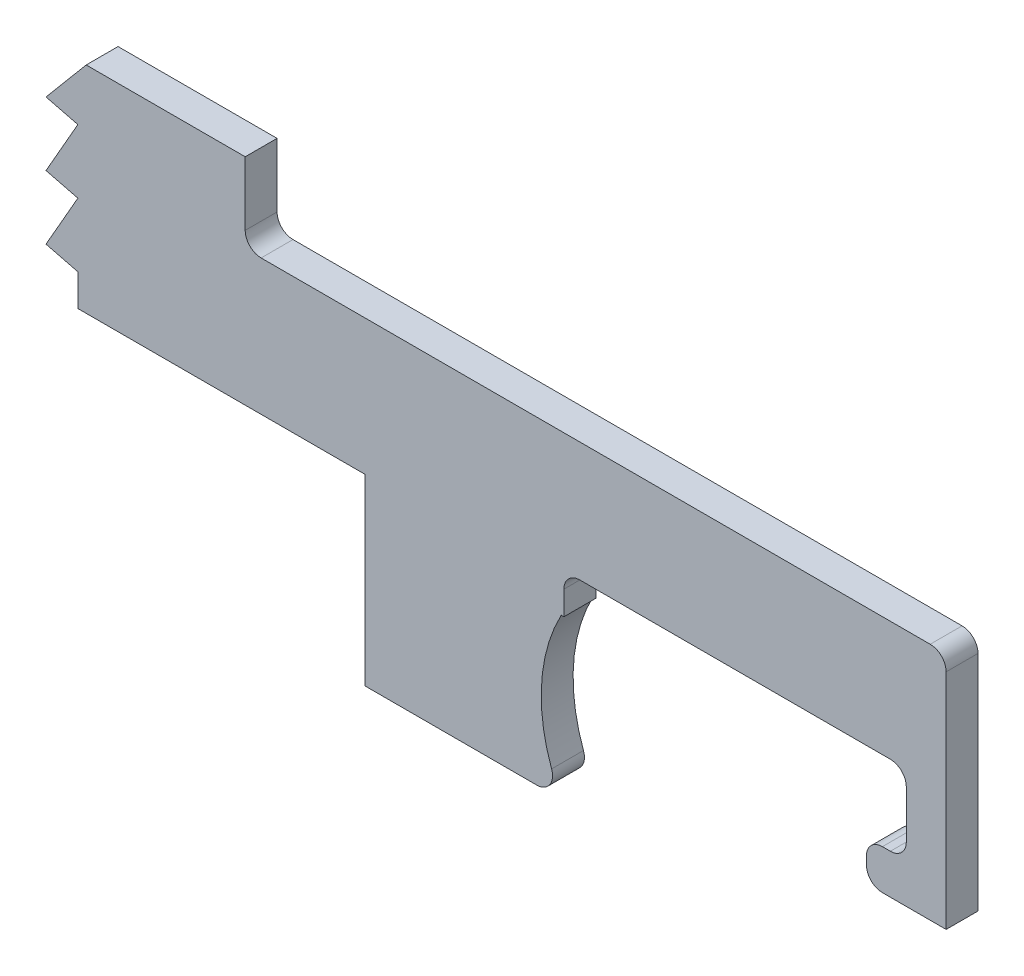
ISO-10303-21;
HEADER;
FILE_DESCRIPTION(('STEP AP214'),'2;1');
FILE_NAME('part.step','',(''),(''),'','','');
FILE_SCHEMA(('AUTOMOTIVE_DESIGN { 1 0 10303 214 1 1 1 1 }'));
ENDSEC;
DATA;
#1=APPLICATION_CONTEXT('core data for automotive mechanical design processes');
#2=APPLICATION_PROTOCOL_DEFINITION('international standard','automotive_design',2000,#1);
#3=PRODUCT_CONTEXT('',#1,'mechanical');
#4=PRODUCT('Part','Part','',(#3));
#5=PRODUCT_RELATED_PRODUCT_CATEGORY('part','',(#4));
#6=PRODUCT_DEFINITION_FORMATION('','',#4);
#7=PRODUCT_DEFINITION_CONTEXT('part definition',#1,'design');
#8=PRODUCT_DEFINITION('design','',#6,#7);
#9=PRODUCT_DEFINITION_SHAPE('','',#8);
#10=(LENGTH_UNIT() NAMED_UNIT(*) SI_UNIT(.MILLI.,.METRE.));
#11=(NAMED_UNIT(*) PLANE_ANGLE_UNIT() SI_UNIT($,.RADIAN.));
#12=(NAMED_UNIT(*) SI_UNIT($,.STERADIAN.) SOLID_ANGLE_UNIT());
#13=UNCERTAINTY_MEASURE_WITH_UNIT(LENGTH_MEASURE(1.E-05),#10,'distance_accuracy_value','');
#14=(GEOMETRIC_REPRESENTATION_CONTEXT(3) GLOBAL_UNCERTAINTY_ASSIGNED_CONTEXT((#13)) GLOBAL_UNIT_ASSIGNED_CONTEXT((#10,
#11,#12)) REPRESENTATION_CONTEXT('',''));
#15=CARTESIAN_POINT('',(0.,0.,0.));
#16=DIRECTION('',(0.,0.,1.));
#17=DIRECTION('',(1.,0.,0.));
#18=AXIS2_PLACEMENT_3D('',#15,#16,#17);
#19=CARTESIAN_POINT('',(-12.17630669051,15.,4.));
#20=DIRECTION('',(0.,-1.,0.));
#21=DIRECTION('',(0.,0.,-1.));
#22=AXIS2_PLACEMENT_3D('',#19,#20,#21);
#23=PLANE('',#22);
#24=DIRECTION('',(-1.,0.,0.));
#25=VECTOR('',#24,1.);
#26=CARTESIAN_POINT('',(-12.17630669051,15.,4.));
#27=LINE('',#26,#25);
#28=CARTESIAN_POINT('',(73.7963422775845,15.,4.));
#29=VERTEX_POINT('',#28);
#30=CARTESIAN_POINT('',(-10.17630669051,15.,4.));
#31=VERTEX_POINT('',#30);
#32=EDGE_CURVE('E283',#29,#31,#27,.T.);
#33=ORIENTED_EDGE('',*,*,#32,.F.);
#34=DIRECTION('',(0.,0.,-1.));
#35=VECTOR('',#34,1.);
#36=CARTESIAN_POINT('',(73.7963422775845,15.,4.));
#37=LINE('',#36,#35);
#38=CARTESIAN_POINT('',(73.7963422775845,15.,0.));
#39=VERTEX_POINT('',#38);
#40=EDGE_CURVE('E436',#29,#39,#37,.T.);
#41=ORIENTED_EDGE('',*,*,#40,.T.);
#42=DIRECTION('',(-1.,0.,0.));
#43=VECTOR('',#42,1.);
#44=CARTESIAN_POINT('',(-12.17630669051,15.,0.));
#45=LINE('',#44,#43);
#46=CARTESIAN_POINT('',(-10.17630669051,15.,0.));
#47=VERTEX_POINT('',#46);
#48=EDGE_CURVE('E282',#39,#47,#45,.T.);
#49=ORIENTED_EDGE('',*,*,#48,.T.);
#50=DIRECTION('',(0.,0.,-1.));
#51=VECTOR('',#50,1.);
#52=CARTESIAN_POINT('',(-10.17630669051,15.,4.));
#53=LINE('',#52,#51);
#54=EDGE_CURVE('E434',#47,#31,#53,.F.);
#55=ORIENTED_EDGE('',*,*,#54,.T.);
#56=EDGE_LOOP('',(#33,#41,#49,#55));
#57=FACE_BOUND('',#56,.T.);
#58=ADVANCED_FACE('F33',(#57),#23,.F.);
#59=CARTESIAN_POINT('',(-12.17630669051,15.,4.));
#60=DIRECTION('',(-1.,0.,0.));
#61=DIRECTION('',(0.,-1.,0.));
#62=AXIS2_PLACEMENT_3D('',#59,#60,#61);
#63=PLANE('',#62);
#64=DIRECTION('',(0.,1.,0.));
#65=VECTOR('',#64,1.);
#66=CARTESIAN_POINT('',(-12.17630669051,15.,4.));
#67=LINE('',#66,#65);
#68=CARTESIAN_POINT('',(-12.17630669051,17.,4.));
#69=VERTEX_POINT('',#68);
#70=CARTESIAN_POINT('',(-12.17630669051,25.,4.));
#71=VERTEX_POINT('',#70);
#72=EDGE_CURVE('E285',#69,#71,#67,.T.);
#73=ORIENTED_EDGE('',*,*,#72,.F.);
#74=DIRECTION('',(0.,0.,-1.));
#75=VECTOR('',#74,1.);
#76=CARTESIAN_POINT('',(-12.17630669051,17.,0.));
#77=LINE('',#76,#75);
#78=CARTESIAN_POINT('',(-12.17630669051,17.,0.));
#79=VERTEX_POINT('',#78);
#80=EDGE_CURVE('E444',#69,#79,#77,.T.);
#81=ORIENTED_EDGE('',*,*,#80,.T.);
#82=DIRECTION('',(0.,1.,0.));
#83=VECTOR('',#82,1.);
#84=CARTESIAN_POINT('',(-12.17630669051,15.,0.));
#85=LINE('',#84,#83);
#86=CARTESIAN_POINT('',(-12.17630669051,25.,0.));
#87=VERTEX_POINT('',#86);
#88=EDGE_CURVE('E323',#79,#87,#85,.T.);
#89=ORIENTED_EDGE('',*,*,#88,.T.);
#90=DIRECTION('',(0.,0.,-1.));
#91=VECTOR('',#90,1.);
#92=CARTESIAN_POINT('',(-12.17630669051,25.,4.));
#93=LINE('',#92,#91);
#94=EDGE_CURVE('E370',#71,#87,#93,.T.);
#95=ORIENTED_EDGE('',*,*,#94,.F.);
#96=EDGE_LOOP('',(#73,#81,#89,#95));
#97=FACE_BOUND('',#96,.T.);
#98=ADVANCED_FACE('F466',(#97),#63,.F.);
#99=CARTESIAN_POINT('',(-12.17630669051,25.,4.));
#100=DIRECTION('',(0.,-1.,0.));
#101=DIRECTION('',(0.,0.,-1.));
#102=AXIS2_PLACEMENT_3D('',#99,#100,#101);
#103=PLANE('',#102);
#104=DIRECTION('',(-1.,0.,0.));
#105=VECTOR('',#104,1.);
#106=CARTESIAN_POINT('',(-12.17630669051,25.,0.));
#107=LINE('',#106,#105);
#108=CARTESIAN_POINT('',(-32.133784183543,25.,0.));
#109=VERTEX_POINT('',#108);
#110=EDGE_CURVE('E325',#87,#109,#107,.T.);
#111=ORIENTED_EDGE('',*,*,#110,.T.);
#112=DIRECTION('',(0.,0.,1.));
#113=VECTOR('',#112,1.);
#114=CARTESIAN_POINT('',(-32.133784183543,25.,-6.));
#115=LINE('',#114,#113);
#116=CARTESIAN_POINT('',(-32.133784183543,25.,4.));
#117=VERTEX_POINT('',#116);
#118=EDGE_CURVE('E269',#109,#117,#115,.T.);
#119=ORIENTED_EDGE('',*,*,#118,.T.);
#120=DIRECTION('',(-1.,0.,0.));
#121=VECTOR('',#120,1.);
#122=CARTESIAN_POINT('',(-12.17630669051,25.,4.));
#123=LINE('',#122,#121);
#124=EDGE_CURVE('E288',#71,#117,#123,.T.);
#125=ORIENTED_EDGE('',*,*,#124,.F.);
#126=ORIENTED_EDGE('',*,*,#94,.T.);
#127=EDGE_LOOP('',(#111,#119,#125,#126));
#128=FACE_BOUND('',#127,.T.);
#129=ADVANCED_FACE('F472',(#128),#103,.F.);
#130=CARTESIAN_POINT('',(-37.17630669051,-1.99999999999999,4.));
#131=DIRECTION('',(0.,1.,0.));
#132=DIRECTION('',(-1.,0.,0.));
#133=AXIS2_PLACEMENT_3D('',#130,#131,#132);
#134=PLANE('',#133);
#135=DIRECTION('',(1.,0.,0.));
#136=VECTOR('',#135,1.);
#137=CARTESIAN_POINT('',(-37.17630669051,-1.99999999999999,4.));
#138=LINE('',#137,#136);
#139=CARTESIAN_POINT('',(-33.17630669051,-2.,4.));
#140=VERTEX_POINT('',#139);
#141=CARTESIAN_POINT('',(2.8880050274753,-2.,4.));
#142=VERTEX_POINT('',#141);
#143=EDGE_CURVE('E291',#140,#142,#138,.T.);
#144=ORIENTED_EDGE('',*,*,#143,.F.);
#145=DIRECTION('',(0.,0.,-1.));
#146=VECTOR('',#145,1.);
#147=CARTESIAN_POINT('',(-33.17630669051,-1.99999999999999,4.));
#148=LINE('',#147,#146);
#149=CARTESIAN_POINT('',(-33.1763066905099,-2.,0.));
#150=VERTEX_POINT('',#149);
#151=EDGE_CURVE('E249',#140,#150,#148,.T.);
#152=ORIENTED_EDGE('',*,*,#151,.T.);
#153=DIRECTION('',(1.,0.,0.));
#154=VECTOR('',#153,1.);
#155=CARTESIAN_POINT('',(-37.17630669051,-1.99999999999999,0.));
#156=LINE('',#155,#154);
#157=CARTESIAN_POINT('',(2.8880050274753,-2.,0.));
#158=VERTEX_POINT('',#157);
#159=EDGE_CURVE('E328',#150,#158,#156,.T.);
#160=ORIENTED_EDGE('',*,*,#159,.T.);
#161=DIRECTION('',(0.,0.,-1.));
#162=VECTOR('',#161,1.);
#163=CARTESIAN_POINT('',(2.8880050274753,-2.,4.));
#164=LINE('',#163,#162);
#165=EDGE_CURVE('E367',#142,#158,#164,.T.);
#166=ORIENTED_EDGE('',*,*,#165,.F.);
#167=EDGE_LOOP('',(#144,#152,#160,#166));
#168=FACE_BOUND('',#167,.T.);
#169=ADVANCED_FACE('F496',(#168),#134,.F.);
#170=CARTESIAN_POINT('',(2.8880050274753,-25.,4.));
#171=DIRECTION('',(1.,0.,0.));
#172=DIRECTION('',(0.,0.,-1.));
#173=AXIS2_PLACEMENT_3D('',#170,#171,#172);
#174=PLANE('',#173);
#175=DIRECTION('',(0.,-1.,0.));
#176=VECTOR('',#175,1.);
#177=CARTESIAN_POINT('',(2.8880050274753,-25.,0.));
#178=LINE('',#177,#176);
#179=CARTESIAN_POINT('',(2.8880050274753,-25.,0.));
#180=VERTEX_POINT('',#179);
#181=EDGE_CURVE('E330',#158,#180,#178,.T.);
#182=ORIENTED_EDGE('',*,*,#181,.T.);
#183=DIRECTION('',(0.,0.,-1.));
#184=VECTOR('',#183,1.);
#185=CARTESIAN_POINT('',(2.8880050274753,-25.,4.));
#186=LINE('',#185,#184);
#187=CARTESIAN_POINT('',(2.8880050274753,-25.,4.));
#188=VERTEX_POINT('',#187);
#189=EDGE_CURVE('E364',#188,#180,#186,.T.);
#190=ORIENTED_EDGE('',*,*,#189,.F.);
#191=DIRECTION('',(0.,-1.,0.));
#192=VECTOR('',#191,1.);
#193=CARTESIAN_POINT('',(2.8880050274753,-25.,4.));
#194=LINE('',#193,#192);
#195=EDGE_CURVE('E293',#142,#188,#194,.T.);
#196=ORIENTED_EDGE('',*,*,#195,.F.);
#197=ORIENTED_EDGE('',*,*,#165,.T.);
#198=EDGE_LOOP('',(#182,#190,#196,#197));
#199=FACE_BOUND('',#198,.T.);
#200=ADVANCED_FACE('F503',(#199),#174,.F.);
#201=CARTESIAN_POINT('',(27.4893066057018,-25.,4.));
#202=DIRECTION('',(0.,1.,0.));
#203=DIRECTION('',(0.,0.,1.));
#204=AXIS2_PLACEMENT_3D('',#201,#202,#203);
#205=PLANE('',#204);
#206=DIRECTION('',(1.,0.,0.));
#207=VECTOR('',#206,1.);
#208=CARTESIAN_POINT('',(27.4893066057018,-25.,0.));
#209=LINE('',#208,#207);
#210=CARTESIAN_POINT('',(24.403013836766,-25.,0.));
#211=VERTEX_POINT('',#210);
#212=EDGE_CURVE('E332',#180,#211,#209,.T.);
#213=ORIENTED_EDGE('',*,*,#212,.T.);
#214=DIRECTION('',(0.,0.,-1.));
#215=VECTOR('',#214,1.);
#216=CARTESIAN_POINT('',(24.403013836766,-25.,4.));
#217=LINE('',#216,#215);
#218=CARTESIAN_POINT('',(24.403013836766,-25.,4.));
#219=VERTEX_POINT('',#218);
#220=EDGE_CURVE('E395',#211,#219,#217,.F.);
#221=ORIENTED_EDGE('',*,*,#220,.T.);
#222=DIRECTION('',(1.,0.,0.));
#223=VECTOR('',#222,1.);
#224=CARTESIAN_POINT('',(27.4893066057018,-25.,4.));
#225=LINE('',#224,#223);
#226=EDGE_CURVE('E295',#188,#219,#225,.T.);
#227=ORIENTED_EDGE('',*,*,#226,.F.);
#228=ORIENTED_EDGE('',*,*,#189,.T.);
#229=EDGE_LOOP('',(#213,#221,#227,#228));
#230=FACE_BOUND('',#229,.T.);
#231=ADVANCED_FACE('F506',(#230),#205,.F.);
#232=CARTESIAN_POINT('',(46.1405700549953,-15.,4.));
#233=DIRECTION('',(0.,0.,-1.));
#234=DIRECTION('',(-1.,0.,0.));
#235=AXIS2_PLACEMENT_3D('',#232,#233,#234);
#236=CYLINDRICAL_SURFACE('',#235,21.1629305214318);
#237=CARTESIAN_POINT('',(46.1405700549953,-15.,4.));
#238=DIRECTION('',(0.,0.,-1.));
#239=DIRECTION('',(-1.,0.,0.));
#240=AXIS2_PLACEMENT_3D('',#237,#238,#239);
#241=CIRCLE('',#240,21.1629305214318);
#242=CARTESIAN_POINT('',(26.2799400916815,-22.309241117604,4.));
#243=VERTEX_POINT('',#242);
#244=CARTESIAN_POINT('',(27.4893066057018,-5.,4.));
#245=VERTEX_POINT('',#244);
#246=EDGE_CURVE('E298',#243,#245,#241,.T.);
#247=ORIENTED_EDGE('',*,*,#246,.F.);
#248=DIRECTION('',(0.,0.,-1.));
#249=VECTOR('',#248,1.);
#250=CARTESIAN_POINT('',(26.2799400916815,-22.309241117604,4.));
#251=LINE('',#250,#249);
#252=CARTESIAN_POINT('',(26.2799400916815,-22.309241117604,0.));
#253=VERTEX_POINT('',#252);
#254=EDGE_CURVE('E386',#243,#253,#251,.T.);
#255=ORIENTED_EDGE('',*,*,#254,.T.);
#256=CARTESIAN_POINT('',(46.1405700549953,-15.,0.));
#257=DIRECTION('',(0.,0.,-1.));
#258=DIRECTION('',(-1.,0.,0.));
#259=AXIS2_PLACEMENT_3D('',#256,#257,#258);
#260=CIRCLE('',#259,21.1629305214318);
#261=CARTESIAN_POINT('',(27.4893066057018,-5.,0.));
#262=VERTEX_POINT('',#261);
#263=EDGE_CURVE('E335',#253,#262,#260,.T.);
#264=ORIENTED_EDGE('',*,*,#263,.T.);
#265=DIRECTION('',(0.,0.,-1.));
#266=VECTOR('',#265,1.);
#267=CARTESIAN_POINT('',(27.4893066057018,-5.,4.));
#268=LINE('',#267,#266);
#269=EDGE_CURVE('E361',#245,#262,#268,.T.);
#270=ORIENTED_EDGE('',*,*,#269,.F.);
#271=EDGE_LOOP('',(#247,#255,#264,#270));
#272=FACE_BOUND('',#271,.T.);
#273=ADVANCED_FACE('F514',(#272),#236,.F.);
#274=CARTESIAN_POINT('',(27.4893066057018,-5.,4.));
#275=DIRECTION('',(0.,1.,0.));
#276=DIRECTION('',(-1.,0.,0.));
#277=AXIS2_PLACEMENT_3D('',#274,#275,#276);
#278=PLANE('',#277);
#279=DIRECTION('',(1.,0.,0.));
#280=VECTOR('',#279,1.);
#281=CARTESIAN_POINT('',(27.4893066057018,-5.,0.));
#282=LINE('',#281,#280);
#283=CARTESIAN_POINT('',(27.82369330949,-4.99999999999999,0.));
#284=VERTEX_POINT('',#283);
#285=EDGE_CURVE('E337',#262,#284,#282,.T.);
#286=ORIENTED_EDGE('',*,*,#285,.T.);
#287=DIRECTION('',(0.,0.,-1.));
#288=VECTOR('',#287,1.);
#289=CARTESIAN_POINT('',(27.82369330949,-4.99999999999999,4.));
#290=LINE('',#289,#288);
#291=CARTESIAN_POINT('',(27.82369330949,-4.99999999999999,4.));
#292=VERTEX_POINT('',#291);
#293=EDGE_CURVE('E358',#292,#284,#290,.T.);
#294=ORIENTED_EDGE('',*,*,#293,.F.);
#295=DIRECTION('',(1.,0.,0.));
#296=VECTOR('',#295,1.);
#297=CARTESIAN_POINT('',(27.4893066057018,-5.,4.));
#298=LINE('',#297,#296);
#299=EDGE_CURVE('E300',#245,#292,#298,.T.);
#300=ORIENTED_EDGE('',*,*,#299,.F.);
#301=ORIENTED_EDGE('',*,*,#269,.T.);
#302=EDGE_LOOP('',(#286,#294,#300,#301));
#303=FACE_BOUND('',#302,.T.);
#304=ADVANCED_FACE('F520',(#303),#278,.F.);
#305=CARTESIAN_POINT('',(27.82369330949,0.,4.));
#306=DIRECTION('',(-1.,0.,0.));
#307=DIRECTION('',(0.,0.,1.));
#308=AXIS2_PLACEMENT_3D('',#305,#306,#307);
#309=PLANE('',#308);
#310=DIRECTION('',(0.,1.,0.));
#311=VECTOR('',#310,1.);
#312=CARTESIAN_POINT('',(27.82369330949,0.,0.));
#313=LINE('',#312,#311);
#314=CARTESIAN_POINT('',(27.82369330949,-1.99999999999999,0.));
#315=VERTEX_POINT('',#314);
#316=EDGE_CURVE('E339',#284,#315,#313,.T.);
#317=ORIENTED_EDGE('',*,*,#316,.T.);
#318=DIRECTION('',(0.,0.,-1.));
#319=VECTOR('',#318,1.);
#320=CARTESIAN_POINT('',(27.82369330949,-1.99999999999999,4.));
#321=LINE('',#320,#319);
#322=CARTESIAN_POINT('',(27.82369330949,-1.99999999999999,4.));
#323=VERTEX_POINT('',#322);
#324=EDGE_CURVE('E432',#315,#323,#321,.F.);
#325=ORIENTED_EDGE('',*,*,#324,.T.);
#326=DIRECTION('',(0.,1.,0.));
#327=VECTOR('',#326,1.);
#328=CARTESIAN_POINT('',(27.82369330949,0.,4.));
#329=LINE('',#328,#327);
#330=EDGE_CURVE('E302',#292,#323,#329,.T.);
#331=ORIENTED_EDGE('',*,*,#330,.F.);
#332=ORIENTED_EDGE('',*,*,#293,.T.);
#333=EDGE_LOOP('',(#317,#325,#331,#332));
#334=FACE_BOUND('',#333,.T.);
#335=ADVANCED_FACE('F748',(#334),#309,.F.);
#336=CARTESIAN_POINT('',(27.82369330949,0.,4.));
#337=DIRECTION('',(0.,1.,0.));
#338=DIRECTION('',(0.,0.,1.));
#339=AXIS2_PLACEMENT_3D('',#336,#337,#338);
#340=PLANE('',#339);
#341=DIRECTION('',(1.,0.,0.));
#342=VECTOR('',#341,1.);
#343=CARTESIAN_POINT('',(27.82369330949,0.,0.));
#344=LINE('',#343,#342);
#345=CARTESIAN_POINT('',(29.8236933094901,0.,0.));
#346=VERTEX_POINT('',#345);
#347=CARTESIAN_POINT('',(68.7963422775845,0.,0.));
#348=VERTEX_POINT('',#347);
#349=EDGE_CURVE('E342',#346,#348,#344,.T.);
#350=ORIENTED_EDGE('',*,*,#349,.T.);
#351=DIRECTION('',(0.,0.,-1.));
#352=VECTOR('',#351,1.);
#353=CARTESIAN_POINT('',(68.7963422775845,0.,4.));
#354=LINE('',#353,#352);
#355=CARTESIAN_POINT('',(68.7963422775845,0.,4.));
#356=VERTEX_POINT('',#355);
#357=EDGE_CURVE('E430',#348,#356,#354,.F.);
#358=ORIENTED_EDGE('',*,*,#357,.T.);
#359=DIRECTION('',(1.,0.,0.));
#360=VECTOR('',#359,1.);
#361=CARTESIAN_POINT('',(27.82369330949,0.,4.));
#362=LINE('',#361,#360);
#363=CARTESIAN_POINT('',(29.8236933094901,0.,4.));
#364=VERTEX_POINT('',#363);
#365=EDGE_CURVE('E305',#364,#356,#362,.T.);
#366=ORIENTED_EDGE('',*,*,#365,.F.);
#367=DIRECTION('',(0.,0.,-1.));
#368=VECTOR('',#367,1.);
#369=CARTESIAN_POINT('',(29.8236933094901,0.,0.));
#370=LINE('',#369,#368);
#371=EDGE_CURVE('E427',#364,#346,#370,.T.);
#372=ORIENTED_EDGE('',*,*,#371,.T.);
#373=EDGE_LOOP('',(#350,#358,#366,#372));
#374=FACE_BOUND('',#373,.T.);
#375=ADVANCED_FACE('F531',(#374),#340,.F.);
#376=CARTESIAN_POINT('',(70.7963422775845,-9.99999999999999,4.));
#377=DIRECTION('',(1.,0.,0.));
#378=DIRECTION('',(0.,0.,-1.));
#379=AXIS2_PLACEMENT_3D('',#376,#377,#378);
#380=PLANE('',#379);
#381=DIRECTION('',(0.,-1.,0.));
#382=VECTOR('',#381,1.);
#383=CARTESIAN_POINT('',(70.7963422775845,-9.99999999999999,4.));
#384=LINE('',#383,#382);
#385=CARTESIAN_POINT('',(70.7963422775845,-1.99999999999999,4.));
#386=VERTEX_POINT('',#385);
#387=CARTESIAN_POINT('',(70.7963422775845,-7.99999999999999,4.));
#388=VERTEX_POINT('',#387);
#389=EDGE_CURVE('E308',#386,#388,#384,.T.);
#390=ORIENTED_EDGE('',*,*,#389,.F.);
#391=DIRECTION('',(0.,0.,-1.));
#392=VECTOR('',#391,1.);
#393=CARTESIAN_POINT('',(70.7963422775845,-1.99999999999999,0.));
#394=LINE('',#393,#392);
#395=CARTESIAN_POINT('',(70.7963422775845,-1.99999999999999,0.));
#396=VERTEX_POINT('',#395);
#397=EDGE_CURVE('E424',#386,#396,#394,.T.);
#398=ORIENTED_EDGE('',*,*,#397,.T.);
#399=DIRECTION('',(0.,-1.,0.));
#400=VECTOR('',#399,1.);
#401=CARTESIAN_POINT('',(70.7963422775845,-9.99999999999999,0.));
#402=LINE('',#401,#400);
#403=CARTESIAN_POINT('',(70.7963422775845,-7.99999999999999,0.));
#404=VERTEX_POINT('',#403);
#405=EDGE_CURVE('E345',#396,#404,#402,.T.);
#406=ORIENTED_EDGE('',*,*,#405,.T.);
#407=DIRECTION('',(0.,0.,-1.));
#408=VECTOR('',#407,1.);
#409=CARTESIAN_POINT('',(70.7963422775845,-7.99999999999999,4.));
#410=LINE('',#409,#408);
#411=EDGE_CURVE('E416',#404,#388,#410,.F.);
#412=ORIENTED_EDGE('',*,*,#411,.T.);
#413=EDGE_LOOP('',(#390,#398,#406,#412));
#414=FACE_BOUND('',#413,.T.);
#415=ADVANCED_FACE('F541',(#414),#380,.F.);
#416=CARTESIAN_POINT('',(65.7963422775845,-9.99999999999999,4.));
#417=DIRECTION('',(0.,-1.,0.));
#418=DIRECTION('',(0.,0.,-1.));
#419=AXIS2_PLACEMENT_3D('',#416,#417,#418);
#420=PLANE('',#419);
#421=DIRECTION('',(-1.,0.,0.));
#422=VECTOR('',#421,1.);
#423=CARTESIAN_POINT('',(65.7963422775845,-9.99999999999999,0.));
#424=LINE('',#423,#422);
#425=CARTESIAN_POINT('',(68.7963422775845,-9.99999999999999,0.));
#426=VERTEX_POINT('',#425);
#427=CARTESIAN_POINT('',(67.7963422775845,-9.99999999999999,0.));
#428=VERTEX_POINT('',#427);
#429=EDGE_CURVE('E347',#426,#428,#424,.T.);
#430=ORIENTED_EDGE('',*,*,#429,.T.);
#431=DIRECTION('',(0.,0.,-1.));
#432=VECTOR('',#431,1.);
#433=CARTESIAN_POINT('',(67.7963422775845,-9.99999999999999,4.));
#434=LINE('',#433,#432);
#435=CARTESIAN_POINT('',(67.7963422775845,-9.99999999999999,4.));
#436=VERTEX_POINT('',#435);
#437=EDGE_CURVE('E414',#428,#436,#434,.F.);
#438=ORIENTED_EDGE('',*,*,#437,.T.);
#439=DIRECTION('',(-1.,0.,0.));
#440=VECTOR('',#439,1.);
#441=CARTESIAN_POINT('',(65.7963422775845,-9.99999999999999,4.));
#442=LINE('',#441,#440);
#443=CARTESIAN_POINT('',(68.7963422775845,-9.99999999999999,4.));
#444=VERTEX_POINT('',#443);
#445=EDGE_CURVE('E310',#444,#436,#442,.T.);
#446=ORIENTED_EDGE('',*,*,#445,.F.);
#447=DIRECTION('',(0.,0.,-1.));
#448=VECTOR('',#447,1.);
#449=CARTESIAN_POINT('',(68.7963422775845,-9.99999999999999,0.));
#450=LINE('',#449,#448);
#451=EDGE_CURVE('E411',#444,#426,#450,.T.);
#452=ORIENTED_EDGE('',*,*,#451,.T.);
#453=EDGE_LOOP('',(#430,#438,#446,#452));
#454=FACE_BOUND('',#453,.T.);
#455=ADVANCED_FACE('F549',(#454),#420,.F.);
#456=CARTESIAN_POINT('',(65.7963422775845,-15.,4.));
#457=DIRECTION('',(1.,0.,0.));
#458=DIRECTION('',(0.,0.,-1.));
#459=AXIS2_PLACEMENT_3D('',#456,#457,#458);
#460=PLANE('',#459);
#461=DIRECTION('',(0.,-1.,0.));
#462=VECTOR('',#461,1.);
#463=CARTESIAN_POINT('',(65.7963422775845,-15.,0.));
#464=LINE('',#463,#462);
#465=CARTESIAN_POINT('',(65.7963422775845,-12.,0.));
#466=VERTEX_POINT('',#465);
#467=CARTESIAN_POINT('',(65.7963422775845,-13.,0.));
#468=VERTEX_POINT('',#467);
#469=EDGE_CURVE('E350',#466,#468,#464,.T.);
#470=ORIENTED_EDGE('',*,*,#469,.T.);
#471=DIRECTION('',(0.,0.,-1.));
#472=VECTOR('',#471,1.);
#473=CARTESIAN_POINT('',(65.7963422775845,-13.,4.));
#474=LINE('',#473,#472);
#475=CARTESIAN_POINT('',(65.7963422775845,-13.,4.));
#476=VERTEX_POINT('',#475);
#477=EDGE_CURVE('E409',#468,#476,#474,.F.);
#478=ORIENTED_EDGE('',*,*,#477,.T.);
#479=DIRECTION('',(0.,-1.,0.));
#480=VECTOR('',#479,1.);
#481=CARTESIAN_POINT('',(65.7963422775845,-15.,4.));
#482=LINE('',#481,#480);
#483=CARTESIAN_POINT('',(65.7963422775845,-12.,4.));
#484=VERTEX_POINT('',#483);
#485=EDGE_CURVE('E313',#484,#476,#482,.T.);
#486=ORIENTED_EDGE('',*,*,#485,.F.);
#487=DIRECTION('',(0.,0.,-1.));
#488=VECTOR('',#487,1.);
#489=CARTESIAN_POINT('',(65.7963422775845,-12.,4.));
#490=LINE('',#489,#488);
#491=EDGE_CURVE('E406',#484,#466,#490,.T.);
#492=ORIENTED_EDGE('',*,*,#491,.T.);
#493=EDGE_LOOP('',(#470,#478,#486,#492));
#494=FACE_BOUND('',#493,.T.);
#495=ADVANCED_FACE('F560',(#494),#460,.F.);
#496=CARTESIAN_POINT('',(75.7963422775845,-15.,4.));
#497=DIRECTION('',(0.,1.,0.));
#498=DIRECTION('',(-1.,0.,0.));
#499=AXIS2_PLACEMENT_3D('',#496,#497,#498);
#500=PLANE('',#499);
#501=DIRECTION('',(1.,0.,0.));
#502=VECTOR('',#501,1.);
#503=CARTESIAN_POINT('',(75.7963422775845,-15.,4.));
#504=LINE('',#503,#502);
#505=CARTESIAN_POINT('',(67.7963422775845,-15.,4.));
#506=VERTEX_POINT('',#505);
#507=CARTESIAN_POINT('',(75.7963422775845,-15.,4.));
#508=VERTEX_POINT('',#507);
#509=EDGE_CURVE('E316',#506,#508,#504,.T.);
#510=ORIENTED_EDGE('',*,*,#509,.F.);
#511=DIRECTION('',(0.,0.,-1.));
#512=VECTOR('',#511,1.);
#513=CARTESIAN_POINT('',(67.7963422775845,-15.,4.));
#514=LINE('',#513,#512);
#515=CARTESIAN_POINT('',(67.7963422775845,-15.,0.));
#516=VERTEX_POINT('',#515);
#517=EDGE_CURVE('E403',#506,#516,#514,.T.);
#518=ORIENTED_EDGE('',*,*,#517,.T.);
#519=DIRECTION('',(1.,0.,0.));
#520=VECTOR('',#519,1.);
#521=CARTESIAN_POINT('',(75.7963422775845,-15.,0.));
#522=LINE('',#521,#520);
#523=CARTESIAN_POINT('',(75.7963422775845,-15.,0.));
#524=VERTEX_POINT('',#523);
#525=EDGE_CURVE('E353',#516,#524,#522,.T.);
#526=ORIENTED_EDGE('',*,*,#525,.T.);
#527=DIRECTION('',(0.,0.,-1.));
#528=VECTOR('',#527,1.);
#529=CARTESIAN_POINT('',(75.7963422775845,-15.,4.));
#530=LINE('',#529,#528);
#531=EDGE_CURVE('E320',#508,#524,#530,.T.);
#532=ORIENTED_EDGE('',*,*,#531,.F.);
#533=EDGE_LOOP('',(#510,#518,#526,#532));
#534=FACE_BOUND('',#533,.T.);
#535=ADVANCED_FACE('F568',(#534),#500,.F.);
#536=CARTESIAN_POINT('',(75.7963422775845,15.,4.));
#537=DIRECTION('',(-1.,0.,0.));
#538=DIRECTION('',(0.,0.,1.));
#539=AXIS2_PLACEMENT_3D('',#536,#537,#538);
#540=PLANE('',#539);
#541=DIRECTION('',(0.,1.,0.));
#542=VECTOR('',#541,1.);
#543=CARTESIAN_POINT('',(75.7963422775845,15.,0.));
#544=LINE('',#543,#542);
#545=CARTESIAN_POINT('',(75.7963422775845,13.,0.));
#546=VERTEX_POINT('',#545);
#547=EDGE_CURVE('E286',#524,#546,#544,.T.);
#548=ORIENTED_EDGE('',*,*,#547,.T.);
#549=DIRECTION('',(0.,0.,-1.));
#550=VECTOR('',#549,1.);
#551=CARTESIAN_POINT('',(75.7963422775845,13.,4.));
#552=LINE('',#551,#550);
#553=CARTESIAN_POINT('',(75.7963422775845,13.,4.));
#554=VERTEX_POINT('',#553);
#555=EDGE_CURVE('E54',#546,#554,#552,.F.);
#556=ORIENTED_EDGE('',*,*,#555,.T.);
#557=DIRECTION('',(0.,1.,0.));
#558=VECTOR('',#557,1.);
#559=CARTESIAN_POINT('',(75.7963422775845,15.,4.));
#560=LINE('',#559,#558);
#561=EDGE_CURVE('E318',#508,#554,#560,.T.);
#562=ORIENTED_EDGE('',*,*,#561,.F.);
#563=ORIENTED_EDGE('',*,*,#531,.T.);
#564=EDGE_LOOP('',(#548,#556,#562,#563));
#565=FACE_BOUND('',#564,.T.);
#566=ADVANCED_FACE('F571',(#565),#540,.F.);
#567=CARTESIAN_POINT('',(46.1405700549953,-15.,4.));
#568=DIRECTION('',(0.,0.,-1.));
#569=DIRECTION('',(-1.,0.,0.));
#570=AXIS2_PLACEMENT_3D('',#567,#568,#569);
#571=PLANE('',#570);
#572=ORIENTED_EDGE('',*,*,#561,.T.);
#573=CARTESIAN_POINT('',(73.7963422775845,13.,4.));
#574=DIRECTION('',(0.,0.,-1.));
#575=DIRECTION('',(-1.,0.,0.));
#576=AXIS2_PLACEMENT_3D('',#573,#574,#575);
#577=CIRCLE('',#576,2.);
#578=EDGE_CURVE('E442',#554,#29,#577,.F.);
#579=ORIENTED_EDGE('',*,*,#578,.T.);
#580=ORIENTED_EDGE('',*,*,#32,.T.);
#581=CARTESIAN_POINT('',(-10.17630669051,17.,4.));
#582=DIRECTION('',(0.,0.,-1.));
#583=DIRECTION('',(-1.,0.,0.));
#584=AXIS2_PLACEMENT_3D('',#581,#582,#583);
#585=CIRCLE('',#584,2.);
#586=EDGE_CURVE('E11',#31,#69,#585,.T.);
#587=ORIENTED_EDGE('',*,*,#586,.T.);
#588=ORIENTED_EDGE('',*,*,#72,.T.);
#589=ORIENTED_EDGE('',*,*,#124,.T.);
#590=DIRECTION('',(0.643380768419607,0.76554633225416,0.));
#591=VECTOR('',#590,1.);
#592=CARTESIAN_POINT('',(-37.17630669051,19.,4.));
#593=LINE('',#592,#591);
#594=CARTESIAN_POINT('',(-37.17630669051,19.,4.));
#595=VERTEX_POINT('',#594);
#596=EDGE_CURVE('E243',#595,#117,#593,.T.);
#597=ORIENTED_EDGE('',*,*,#596,.F.);
#598=DIRECTION('',(-0.970142500145332,0.242535625036333,0.));
#599=VECTOR('',#598,1.);
#600=CARTESIAN_POINT('',(-37.17630669051,19.,4.));
#601=LINE('',#600,#599);
#602=CARTESIAN_POINT('',(-33.17630669051,18.,4.));
#603=VERTEX_POINT('',#602);
#604=EDGE_CURVE('E265',#603,#595,#601,.T.);
#605=ORIENTED_EDGE('',*,*,#604,.F.);
#606=DIRECTION('',(0.496138938356834,0.868243142124459,0.));
#607=VECTOR('',#606,1.);
#608=CARTESIAN_POINT('',(-33.17630669051,18.,4.));
#609=LINE('',#608,#607);
#610=CARTESIAN_POINT('',(-37.17630669051,11.,4.));
#611=VERTEX_POINT('',#610);
#612=EDGE_CURVE('E262',#611,#603,#609,.T.);
#613=ORIENTED_EDGE('',*,*,#612,.F.);
#614=DIRECTION('',(-0.970142500145332,0.242535625036333,0.));
#615=VECTOR('',#614,1.);
#616=CARTESIAN_POINT('',(-37.17630669051,11.,4.));
#617=LINE('',#616,#615);
#618=CARTESIAN_POINT('',(-33.17630669051,9.99999999999999,4.));
#619=VERTEX_POINT('',#618);
#620=EDGE_CURVE('E257',#619,#611,#617,.T.);
#621=ORIENTED_EDGE('',*,*,#620,.F.);
#622=DIRECTION('',(0.496138938356835,0.868243142124459,0.));
#623=VECTOR('',#622,1.);
#624=CARTESIAN_POINT('',(-33.17630669051,9.99999999999999,4.));
#625=LINE('',#624,#623);
#626=CARTESIAN_POINT('',(-37.17630669051,3.00000000000001,4.));
#627=VERTEX_POINT('',#626);
#628=EDGE_CURVE('E255',#627,#619,#625,.T.);
#629=ORIENTED_EDGE('',*,*,#628,.F.);
#630=DIRECTION('',(-0.970142500145332,0.242535625036333,0.));
#631=VECTOR('',#630,1.);
#632=CARTESIAN_POINT('',(-37.17630669051,3.00000000000001,4.));
#633=LINE('',#632,#631);
#634=CARTESIAN_POINT('',(-33.17630669051,2.00000000000001,4.));
#635=VERTEX_POINT('',#634);
#636=EDGE_CURVE('E236',#635,#627,#633,.T.);
#637=ORIENTED_EDGE('',*,*,#636,.F.);
#638=DIRECTION('',(0.,1.,0.));
#639=VECTOR('',#638,1.);
#640=CARTESIAN_POINT('',(-33.17630669051,-2.2426822871644,4.));
#641=LINE('',#640,#639);
#642=EDGE_CURVE('E246',#140,#635,#641,.T.);
#643=ORIENTED_EDGE('',*,*,#642,.F.);
#644=ORIENTED_EDGE('',*,*,#143,.T.);
#645=ORIENTED_EDGE('',*,*,#195,.T.);
#646=ORIENTED_EDGE('',*,*,#226,.T.);
#647=CARTESIAN_POINT('',(24.403013836766,-23.,4.));
#648=DIRECTION('',(0.,0.,-1.));
#649=DIRECTION('',(-1.,0.,0.));
#650=AXIS2_PLACEMENT_3D('',#647,#648,#649);
#651=CIRCLE('',#650,2.);
#652=EDGE_CURVE('E401',#219,#243,#651,.F.);
#653=ORIENTED_EDGE('',*,*,#652,.T.);
#654=ORIENTED_EDGE('',*,*,#246,.T.);
#655=ORIENTED_EDGE('',*,*,#299,.T.);
#656=ORIENTED_EDGE('',*,*,#330,.T.);
#657=CARTESIAN_POINT('',(29.8236933094901,-1.99999999999999,4.));
#658=DIRECTION('',(0.,0.,-1.));
#659=DIRECTION('',(-1.,0.,0.));
#660=AXIS2_PLACEMENT_3D('',#657,#658,#659);
#661=CIRCLE('',#660,2.);
#662=EDGE_CURVE('E453',#323,#364,#661,.T.);
#663=ORIENTED_EDGE('',*,*,#662,.T.);
#664=ORIENTED_EDGE('',*,*,#365,.T.);
#665=CARTESIAN_POINT('',(68.7963422775845,-1.99999999999999,4.));
#666=DIRECTION('',(0.,0.,-1.));
#667=DIRECTION('',(-1.,0.,0.));
#668=AXIS2_PLACEMENT_3D('',#665,#666,#667);
#669=CIRCLE('',#668,2.);
#670=EDGE_CURVE('E449',#356,#386,#669,.T.);
#671=ORIENTED_EDGE('',*,*,#670,.T.);
#672=ORIENTED_EDGE('',*,*,#389,.T.);
#673=CARTESIAN_POINT('',(68.7963422775845,-7.99999999999999,4.));
#674=DIRECTION('',(0.,0.,-1.));
#675=DIRECTION('',(-1.,0.,0.));
#676=AXIS2_PLACEMENT_3D('',#673,#674,#675);
#677=CIRCLE('',#676,2.);
#678=EDGE_CURVE('E422',#388,#444,#677,.T.);
#679=ORIENTED_EDGE('',*,*,#678,.T.);
#680=ORIENTED_EDGE('',*,*,#445,.T.);
#681=CARTESIAN_POINT('',(67.7963422775845,-12.,4.));
#682=DIRECTION('',(0.,0.,-1.));
#683=DIRECTION('',(-1.,0.,0.));
#684=AXIS2_PLACEMENT_3D('',#681,#682,#683);
#685=CIRCLE('',#684,2.);
#686=EDGE_CURVE('E397',#436,#484,#685,.F.);
#687=ORIENTED_EDGE('',*,*,#686,.T.);
#688=ORIENTED_EDGE('',*,*,#485,.T.);
#689=CARTESIAN_POINT('',(67.7963422775845,-13.,4.));
#690=DIRECTION('',(0.,0.,-1.));
#691=DIRECTION('',(-1.,0.,0.));
#692=AXIS2_PLACEMENT_3D('',#689,#690,#691);
#693=CIRCLE('',#692,2.);
#694=EDGE_CURVE('E399',#476,#506,#693,.F.);
#695=ORIENTED_EDGE('',*,*,#694,.T.);
#696=ORIENTED_EDGE('',*,*,#509,.T.);
#697=EDGE_LOOP('',(#572,#579,#580,#587,#588,#589,#597,#605,#613,#621,#629,#637,#643,#644,#645,
#646,#653,#654,#655,#656,#663,#664,#671,#672,#679,#680,#687,#688,#695,#696));
#698=FACE_BOUND('',#697,.T.);
#699=ADVANCED_FACE('F252',(#698),#571,.F.);
#700=CARTESIAN_POINT('',(46.1405700549953,-15.,0.));
#701=DIRECTION('',(0.,0.,-1.));
#702=DIRECTION('',(-1.,0.,0.));
#703=AXIS2_PLACEMENT_3D('',#700,#701,#702);
#704=PLANE('',#703);
#705=ORIENTED_EDGE('',*,*,#48,.F.);
#706=CARTESIAN_POINT('',(73.7963422775845,13.,0.));
#707=DIRECTION('',(0.,0.,-1.));
#708=DIRECTION('',(-1.,0.,0.));
#709=AXIS2_PLACEMENT_3D('',#706,#707,#708);
#710=CIRCLE('',#709,2.);
#711=EDGE_CURVE('E439',#39,#546,#710,.T.);
#712=ORIENTED_EDGE('',*,*,#711,.T.);
#713=ORIENTED_EDGE('',*,*,#547,.F.);
#714=ORIENTED_EDGE('',*,*,#525,.F.);
#715=CARTESIAN_POINT('',(67.7963422775845,-13.,0.));
#716=DIRECTION('',(0.,0.,-1.));
#717=DIRECTION('',(-1.,0.,0.));
#718=AXIS2_PLACEMENT_3D('',#715,#716,#717);
#719=CIRCLE('',#718,2.);
#720=EDGE_CURVE('E391',#516,#468,#719,.T.);
#721=ORIENTED_EDGE('',*,*,#720,.T.);
#722=ORIENTED_EDGE('',*,*,#469,.F.);
#723=CARTESIAN_POINT('',(67.7963422775845,-12.,0.));
#724=DIRECTION('',(0.,0.,-1.));
#725=DIRECTION('',(-1.,0.,0.));
#726=AXIS2_PLACEMENT_3D('',#723,#724,#725);
#727=CIRCLE('',#726,2.);
#728=EDGE_CURVE('E389',#466,#428,#727,.T.);
#729=ORIENTED_EDGE('',*,*,#728,.T.);
#730=ORIENTED_EDGE('',*,*,#429,.F.);
#731=CARTESIAN_POINT('',(68.7963422775845,-7.99999999999999,0.));
#732=DIRECTION('',(0.,0.,-1.));
#733=DIRECTION('',(-1.,0.,0.));
#734=AXIS2_PLACEMENT_3D('',#731,#732,#733);
#735=CIRCLE('',#734,2.);
#736=EDGE_CURVE('E419',#426,#404,#735,.F.);
#737=ORIENTED_EDGE('',*,*,#736,.T.);
#738=ORIENTED_EDGE('',*,*,#405,.F.);
#739=CARTESIAN_POINT('',(68.7963422775845,-1.99999999999999,0.));
#740=DIRECTION('',(0.,0.,-1.));
#741=DIRECTION('',(-1.,0.,0.));
#742=AXIS2_PLACEMENT_3D('',#739,#740,#741);
#743=CIRCLE('',#742,2.);
#744=EDGE_CURVE('E447',#396,#348,#743,.F.);
#745=ORIENTED_EDGE('',*,*,#744,.T.);
#746=ORIENTED_EDGE('',*,*,#349,.F.);
#747=CARTESIAN_POINT('',(29.8236933094901,-1.99999999999999,0.));
#748=DIRECTION('',(0.,0.,-1.));
#749=DIRECTION('',(-1.,0.,0.));
#750=AXIS2_PLACEMENT_3D('',#747,#748,#749);
#751=CIRCLE('',#750,2.);
#752=EDGE_CURVE('E451',#346,#315,#751,.F.);
#753=ORIENTED_EDGE('',*,*,#752,.T.);
#754=ORIENTED_EDGE('',*,*,#316,.F.);
#755=ORIENTED_EDGE('',*,*,#285,.F.);
#756=ORIENTED_EDGE('',*,*,#263,.F.);
#757=CARTESIAN_POINT('',(24.403013836766,-23.,0.));
#758=DIRECTION('',(0.,0.,-1.));
#759=DIRECTION('',(-1.,0.,0.));
#760=AXIS2_PLACEMENT_3D('',#757,#758,#759);
#761=CIRCLE('',#760,2.);
#762=EDGE_CURVE('E393',#253,#211,#761,.T.);
#763=ORIENTED_EDGE('',*,*,#762,.T.);
#764=ORIENTED_EDGE('',*,*,#212,.F.);
#765=ORIENTED_EDGE('',*,*,#181,.F.);
#766=ORIENTED_EDGE('',*,*,#159,.F.);
#767=DIRECTION('',(0.,-1.,0.));
#768=VECTOR('',#767,1.);
#769=CARTESIAN_POINT('',(-33.1763066905099,-15.,0.));
#770=LINE('',#769,#768);
#771=CARTESIAN_POINT('',(-33.1763066905099,2.,0.));
#772=VERTEX_POINT('',#771);
#773=EDGE_CURVE('E373',#772,#150,#770,.T.);
#774=ORIENTED_EDGE('',*,*,#773,.F.);
#775=DIRECTION('',(0.970142500145332,-0.242535625036333,0.));
#776=VECTOR('',#775,1.);
#777=CARTESIAN_POINT('',(45.4748714229067,-17.6627945283541,0.));
#778=LINE('',#777,#776);
#779=CARTESIAN_POINT('',(-37.17630669051,3.00000000000001,0.));
#780=VERTEX_POINT('',#779);
#781=EDGE_CURVE('E239',#780,#772,#778,.T.);
#782=ORIENTED_EDGE('',*,*,#781,.F.);
#783=DIRECTION('',(-0.496138938356835,-0.868243142124459,0.));
#784=VECTOR('',#783,1.);
#785=CARTESIAN_POINT('',(-24.421383183924,25.3211161365254,0.));
#786=LINE('',#785,#784);
#787=CARTESIAN_POINT('',(-33.17630669051,9.99999999999999,0.));
#788=VERTEX_POINT('',#787);
#789=EDGE_CURVE('E376',#788,#780,#786,.T.);
#790=ORIENTED_EDGE('',*,*,#789,.F.);
#791=DIRECTION('',(0.970142500145332,-0.242535625036333,0.));
#792=VECTOR('',#791,1.);
#793=CARTESIAN_POINT('',(47.3572243640832,-10.1333827636483,0.));
#794=LINE('',#793,#792);
#795=CARTESIAN_POINT('',(-37.17630669051,11.,0.));
#796=VERTEX_POINT('',#795);
#797=EDGE_CURVE('E378',#796,#788,#794,.T.);
#798=ORIENTED_EDGE('',*,*,#797,.F.);
#799=DIRECTION('',(-0.496138938356834,-0.868243142124459,0.));
#800=VECTOR('',#799,1.);
#801=CARTESIAN_POINT('',(-27.8675370300779,27.2903469057561,0.));
#802=LINE('',#801,#800);
#803=CARTESIAN_POINT('',(-33.17630669051,18.,0.));
#804=VERTEX_POINT('',#803);
#805=EDGE_CURVE('E380',#804,#796,#802,.T.);
#806=ORIENTED_EDGE('',*,*,#805,.F.);
#807=DIRECTION('',(0.970142500145332,-0.242535625036333,0.));
#808=VECTOR('',#807,1.);
#809=CARTESIAN_POINT('',(49.2395773052597,-2.60397099894241,0.));
#810=LINE('',#809,#808);
#811=CARTESIAN_POINT('',(-37.17630669051,19.,0.));
#812=VERTEX_POINT('',#811);
#813=EDGE_CURVE('E382',#812,#804,#810,.T.);
#814=ORIENTED_EDGE('',*,*,#813,.F.);
#815=DIRECTION('',(-0.643380768419607,-0.76554633225416,0.));
#816=VECTOR('',#815,1.);
#817=CARTESIAN_POINT('',(-19.4345023884815,40.1106297820372,0.));
#818=LINE('',#817,#816);
#819=EDGE_CURVE('E384',#109,#812,#818,.T.);
#820=ORIENTED_EDGE('',*,*,#819,.F.);
#821=ORIENTED_EDGE('',*,*,#110,.F.);
#822=ORIENTED_EDGE('',*,*,#88,.F.);
#823=CARTESIAN_POINT('',(-10.17630669051,17.,0.));
#824=DIRECTION('',(0.,0.,-1.));
#825=DIRECTION('',(-1.,0.,0.));
#826=AXIS2_PLACEMENT_3D('',#823,#824,#825);
#827=CIRCLE('',#826,2.);
#828=EDGE_CURVE('E41',#79,#47,#827,.F.);
#829=ORIENTED_EDGE('',*,*,#828,.T.);
#830=EDGE_LOOP('',(#705,#712,#713,#714,#721,#722,#729,#730,#737,#738,#745,#746,#753,#754,#755,
#756,#763,#764,#765,#766,#774,#782,#790,#798,#806,#814,#820,#821,#822,#829));
#831=FACE_BOUND('',#830,.T.);
#832=ADVANCED_FACE('F457',(#831),#704,.T.);
#833=CARTESIAN_POINT('',(-33.17630669051,-2.2426822871644,-6.));
#834=DIRECTION('',(1.,0.,0.));
#835=DIRECTION('',(0.,0.,-1.));
#836=AXIS2_PLACEMENT_3D('',#833,#834,#835);
#837=PLANE('',#836);
#838=ORIENTED_EDGE('',*,*,#642,.T.);
#839=DIRECTION('',(0.,0.,1.));
#840=VECTOR('',#839,1.);
#841=CARTESIAN_POINT('',(-33.17630669051,2.00000000000001,-6.));
#842=LINE('',#841,#840);
#843=EDGE_CURVE('E231',#772,#635,#842,.T.);
#844=ORIENTED_EDGE('',*,*,#843,.F.);
#845=ORIENTED_EDGE('',*,*,#773,.T.);
#846=ORIENTED_EDGE('',*,*,#151,.F.);
#847=EDGE_LOOP('',(#838,#844,#845,#846));
#848=FACE_BOUND('',#847,.T.);
#849=ADVANCED_FACE('F247',(#848),#837,.F.);
#850=CARTESIAN_POINT('',(-37.17630669051,19.,-6.));
#851=DIRECTION('',(0.76554633225416,-0.643380768419607,0.));
#852=DIRECTION('',(0.643380768419607,0.76554633225416,0.));
#853=AXIS2_PLACEMENT_3D('',#850,#851,#852);
#854=PLANE('',#853);
#855=ORIENTED_EDGE('',*,*,#819,.T.);
#856=DIRECTION('',(0.,0.,1.));
#857=VECTOR('',#856,1.);
#858=CARTESIAN_POINT('',(-37.17630669051,19.,-6.));
#859=LINE('',#858,#857);
#860=EDGE_CURVE('E272',#812,#595,#859,.T.);
#861=ORIENTED_EDGE('',*,*,#860,.T.);
#862=ORIENTED_EDGE('',*,*,#596,.T.);
#863=ORIENTED_EDGE('',*,*,#118,.F.);
#864=EDGE_LOOP('',(#855,#861,#862,#863));
#865=FACE_BOUND('',#864,.T.);
#866=ADVANCED_FACE('F475',(#865),#854,.F.);
#867=CARTESIAN_POINT('',(-37.17630669051,19.,-6.));
#868=DIRECTION('',(0.242535625036333,0.970142500145332,0.));
#869=DIRECTION('',(-0.970142500145332,0.242535625036333,0.));
#870=AXIS2_PLACEMENT_3D('',#867,#868,#869);
#871=PLANE('',#870);
#872=ORIENTED_EDGE('',*,*,#813,.T.);
#873=DIRECTION('',(0.,0.,1.));
#874=VECTOR('',#873,1.);
#875=CARTESIAN_POINT('',(-33.17630669051,18.,-6.));
#876=LINE('',#875,#874);
#877=EDGE_CURVE('E274',#804,#603,#876,.T.);
#878=ORIENTED_EDGE('',*,*,#877,.T.);
#879=ORIENTED_EDGE('',*,*,#604,.T.);
#880=ORIENTED_EDGE('',*,*,#860,.F.);
#881=EDGE_LOOP('',(#872,#878,#879,#880));
#882=FACE_BOUND('',#881,.T.);
#883=ADVANCED_FACE('F482',(#882),#871,.F.);
#884=CARTESIAN_POINT('',(-33.17630669051,18.,-6.));
#885=DIRECTION('',(0.868243142124459,-0.496138938356834,0.));
#886=DIRECTION('',(0.496138938356834,0.868243142124459,0.));
#887=AXIS2_PLACEMENT_3D('',#884,#885,#886);
#888=PLANE('',#887);
#889=ORIENTED_EDGE('',*,*,#805,.T.);
#890=DIRECTION('',(0.,0.,1.));
#891=VECTOR('',#890,1.);
#892=CARTESIAN_POINT('',(-37.17630669051,11.,-6.));
#893=LINE('',#892,#891);
#894=EDGE_CURVE('E276',#796,#611,#893,.T.);
#895=ORIENTED_EDGE('',*,*,#894,.T.);
#896=ORIENTED_EDGE('',*,*,#612,.T.);
#897=ORIENTED_EDGE('',*,*,#877,.F.);
#898=EDGE_LOOP('',(#889,#895,#896,#897));
#899=FACE_BOUND('',#898,.T.);
#900=ADVANCED_FACE('F484',(#899),#888,.F.);
#901=CARTESIAN_POINT('',(-37.17630669051,11.,-6.));
#902=DIRECTION('',(0.242535625036333,0.970142500145332,0.));
#903=DIRECTION('',(-0.970142500145332,0.242535625036333,0.));
#904=AXIS2_PLACEMENT_3D('',#901,#902,#903);
#905=PLANE('',#904);
#906=ORIENTED_EDGE('',*,*,#797,.T.);
#907=DIRECTION('',(0.,0.,1.));
#908=VECTOR('',#907,1.);
#909=CARTESIAN_POINT('',(-33.17630669051,9.99999999999999,-6.));
#910=LINE('',#909,#908);
#911=EDGE_CURVE('E278',#788,#619,#910,.T.);
#912=ORIENTED_EDGE('',*,*,#911,.T.);
#913=ORIENTED_EDGE('',*,*,#620,.T.);
#914=ORIENTED_EDGE('',*,*,#894,.F.);
#915=EDGE_LOOP('',(#906,#912,#913,#914));
#916=FACE_BOUND('',#915,.T.);
#917=ADVANCED_FACE('F488',(#916),#905,.F.);
#918=CARTESIAN_POINT('',(-33.17630669051,9.99999999999999,-6.));
#919=DIRECTION('',(0.868243142124459,-0.496138938356835,0.));
#920=DIRECTION('',(0.496138938356835,0.868243142124459,0.));
#921=AXIS2_PLACEMENT_3D('',#918,#919,#920);
#922=PLANE('',#921);
#923=ORIENTED_EDGE('',*,*,#789,.T.);
#924=DIRECTION('',(0.,0.,1.));
#925=VECTOR('',#924,1.);
#926=CARTESIAN_POINT('',(-37.17630669051,3.00000000000001,-6.));
#927=LINE('',#926,#925);
#928=EDGE_CURVE('E242',#780,#627,#927,.T.);
#929=ORIENTED_EDGE('',*,*,#928,.T.);
#930=ORIENTED_EDGE('',*,*,#628,.T.);
#931=ORIENTED_EDGE('',*,*,#911,.F.);
#932=EDGE_LOOP('',(#923,#929,#930,#931));
#933=FACE_BOUND('',#932,.T.);
#934=ADVANCED_FACE('F492',(#933),#922,.F.);
#935=CARTESIAN_POINT('',(-37.17630669051,3.00000000000001,-6.));
#936=DIRECTION('',(0.242535625036333,0.970142500145332,0.));
#937=DIRECTION('',(-0.970142500145332,0.242535625036333,0.));
#938=AXIS2_PLACEMENT_3D('',#935,#936,#937);
#939=PLANE('',#938);
#940=ORIENTED_EDGE('',*,*,#781,.T.);
#941=ORIENTED_EDGE('',*,*,#843,.T.);
#942=ORIENTED_EDGE('',*,*,#636,.T.);
#943=ORIENTED_EDGE('',*,*,#928,.F.);
#944=EDGE_LOOP('',(#940,#941,#942,#943));
#945=FACE_BOUND('',#944,.T.);
#946=ADVANCED_FACE('F233',(#945),#939,.F.);
#947=CARTESIAN_POINT('',(24.403013836766,-23.,4.));
#948=DIRECTION('',(0.,0.,-1.));
#949=DIRECTION('',(-1.,0.,0.));
#950=AXIS2_PLACEMENT_3D('',#947,#948,#949);
#951=CYLINDRICAL_SURFACE('',#950,2.);
#952=ORIENTED_EDGE('',*,*,#652,.F.);
#953=ORIENTED_EDGE('',*,*,#220,.F.);
#954=ORIENTED_EDGE('',*,*,#762,.F.);
#955=ORIENTED_EDGE('',*,*,#254,.F.);
#956=EDGE_LOOP('',(#952,#953,#954,#955));
#957=FACE_BOUND('',#956,.T.);
#958=ADVANCED_FACE('F509',(#957),#951,.T.);
#959=CARTESIAN_POINT('',(67.7963422775845,-13.,4.));
#960=DIRECTION('',(0.,0.,-1.));
#961=DIRECTION('',(-1.,0.,0.));
#962=AXIS2_PLACEMENT_3D('',#959,#960,#961);
#963=CYLINDRICAL_SURFACE('',#962,2.);
#964=ORIENTED_EDGE('',*,*,#694,.F.);
#965=ORIENTED_EDGE('',*,*,#477,.F.);
#966=ORIENTED_EDGE('',*,*,#720,.F.);
#967=ORIENTED_EDGE('',*,*,#517,.F.);
#968=EDGE_LOOP('',(#964,#965,#966,#967));
#969=FACE_BOUND('',#968,.T.);
#970=ADVANCED_FACE('F563',(#969),#963,.T.);
#971=CARTESIAN_POINT('',(67.7963422775845,-12.,4.));
#972=DIRECTION('',(0.,0.,-1.));
#973=DIRECTION('',(-1.,0.,0.));
#974=AXIS2_PLACEMENT_3D('',#971,#972,#973);
#975=CYLINDRICAL_SURFACE('',#974,2.);
#976=ORIENTED_EDGE('',*,*,#686,.F.);
#977=ORIENTED_EDGE('',*,*,#437,.F.);
#978=ORIENTED_EDGE('',*,*,#728,.F.);
#979=ORIENTED_EDGE('',*,*,#491,.F.);
#980=EDGE_LOOP('',(#976,#977,#978,#979));
#981=FACE_BOUND('',#980,.T.);
#982=ADVANCED_FACE('F555',(#981),#975,.T.);
#983=CARTESIAN_POINT('',(68.7963422775845,-7.99999999999999,4.));
#984=DIRECTION('',(0.,0.,1.));
#985=DIRECTION('',(1.,0.,0.));
#986=AXIS2_PLACEMENT_3D('',#983,#984,#985);
#987=CYLINDRICAL_SURFACE('',#986,2.);
#988=ORIENTED_EDGE('',*,*,#678,.F.);
#989=ORIENTED_EDGE('',*,*,#411,.F.);
#990=ORIENTED_EDGE('',*,*,#736,.F.);
#991=ORIENTED_EDGE('',*,*,#451,.F.);
#992=EDGE_LOOP('',(#988,#989,#990,#991));
#993=FACE_BOUND('',#992,.T.);
#994=ADVANCED_FACE('F552',(#993),#987,.F.);
#995=CARTESIAN_POINT('',(68.7963422775845,-1.99999999999999,4.));
#996=DIRECTION('',(0.,0.,1.));
#997=DIRECTION('',(1.,0.,0.));
#998=AXIS2_PLACEMENT_3D('',#995,#996,#997);
#999=CYLINDRICAL_SURFACE('',#998,2.);
#1000=ORIENTED_EDGE('',*,*,#670,.F.);
#1001=ORIENTED_EDGE('',*,*,#357,.F.);
#1002=ORIENTED_EDGE('',*,*,#744,.F.);
#1003=ORIENTED_EDGE('',*,*,#397,.F.);
#1004=EDGE_LOOP('',(#1000,#1001,#1002,#1003));
#1005=FACE_BOUND('',#1004,.T.);
#1006=ADVANCED_FACE('F538',(#1005),#999,.F.);
#1007=CARTESIAN_POINT('',(29.8236933094901,-1.99999999999999,4.));
#1008=DIRECTION('',(0.,0.,1.));
#1009=DIRECTION('',(1.,0.,0.));
#1010=AXIS2_PLACEMENT_3D('',#1007,#1008,#1009);
#1011=CYLINDRICAL_SURFACE('',#1010,2.);
#1012=ORIENTED_EDGE('',*,*,#662,.F.);
#1013=ORIENTED_EDGE('',*,*,#324,.F.);
#1014=ORIENTED_EDGE('',*,*,#752,.F.);
#1015=ORIENTED_EDGE('',*,*,#371,.F.);
#1016=EDGE_LOOP('',(#1012,#1013,#1014,#1015));
#1017=FACE_BOUND('',#1016,.T.);
#1018=ADVANCED_FACE('F528',(#1017),#1011,.F.);
#1019=CARTESIAN_POINT('',(73.7963422775845,13.,4.));
#1020=DIRECTION('',(0.,0.,-1.));
#1021=DIRECTION('',(-1.,0.,0.));
#1022=AXIS2_PLACEMENT_3D('',#1019,#1020,#1021);
#1023=CYLINDRICAL_SURFACE('',#1022,2.);
#1024=ORIENTED_EDGE('',*,*,#578,.F.);
#1025=ORIENTED_EDGE('',*,*,#555,.F.);
#1026=ORIENTED_EDGE('',*,*,#711,.F.);
#1027=ORIENTED_EDGE('',*,*,#40,.F.);
#1028=EDGE_LOOP('',(#1024,#1025,#1026,#1027));
#1029=FACE_BOUND('',#1028,.T.);
#1030=ADVANCED_FACE('F574',(#1029),#1023,.T.);
#1031=CARTESIAN_POINT('',(-10.17630669051,17.,4.));
#1032=DIRECTION('',(0.,0.,1.));
#1033=DIRECTION('',(1.,0.,0.));
#1034=AXIS2_PLACEMENT_3D('',#1031,#1032,#1033);
#1035=CYLINDRICAL_SURFACE('',#1034,2.);
#1036=ORIENTED_EDGE('',*,*,#586,.F.);
#1037=ORIENTED_EDGE('',*,*,#54,.F.);
#1038=ORIENTED_EDGE('',*,*,#828,.F.);
#1039=ORIENTED_EDGE('',*,*,#80,.F.);
#1040=EDGE_LOOP('',(#1036,#1037,#1038,#1039));
#1041=FACE_BOUND('',#1040,.T.);
#1042=ADVANCED_FACE('F35',(#1041),#1035,.F.);
#1043=CLOSED_SHELL('',(#58,#98,#129,#169,#200,#231,#273,#304,#335,#375,#415,#455,#495,#535,#566,
#699,#832,#849,#866,#883,#900,#917,#934,#946,#958,#970,#982,#994,#1006,#1018,#1030,#1042));
#1044=MANIFOLD_SOLID_BREP('B2',#1043);
#1045=ADVANCED_BREP_SHAPE_REPRESENTATION('',(#18,#1044),#14);
#1046=SHAPE_DEFINITION_REPRESENTATION(#9,#1045);
ENDSEC;
END-ISO-10303-21;
